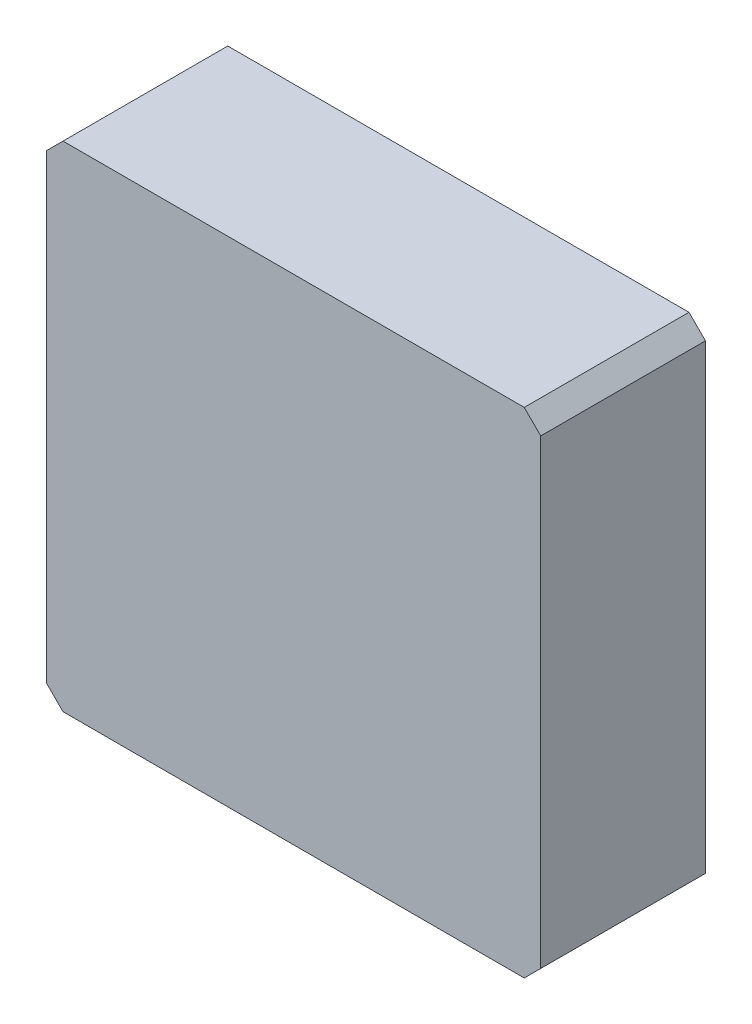
ISO-10303-21;
HEADER;
FILE_DESCRIPTION(('STEP AP214'),'2;1');
FILE_NAME('part.step','',(''),(''),'','','');
FILE_SCHEMA(('AUTOMOTIVE_DESIGN { 1 0 10303 214 1 1 1 1 }'));
ENDSEC;
DATA;
#1=APPLICATION_CONTEXT('core data for automotive mechanical design processes');
#2=APPLICATION_PROTOCOL_DEFINITION('international standard','automotive_design',2000,#1);
#3=PRODUCT_CONTEXT('',#1,'mechanical');
#4=PRODUCT('Part','Part','',(#3));
#5=PRODUCT_RELATED_PRODUCT_CATEGORY('part','',(#4));
#6=PRODUCT_DEFINITION_FORMATION('','',#4);
#7=PRODUCT_DEFINITION_CONTEXT('part definition',#1,'design');
#8=PRODUCT_DEFINITION('design','',#6,#7);
#9=PRODUCT_DEFINITION_SHAPE('','',#8);
#10=(LENGTH_UNIT() NAMED_UNIT(*) SI_UNIT(.MILLI.,.METRE.));
#11=(NAMED_UNIT(*) PLANE_ANGLE_UNIT() SI_UNIT($,.RADIAN.));
#12=(NAMED_UNIT(*) SI_UNIT($,.STERADIAN.) SOLID_ANGLE_UNIT());
#13=UNCERTAINTY_MEASURE_WITH_UNIT(LENGTH_MEASURE(1.E-05),#10,'distance_accuracy_value','');
#14=(GEOMETRIC_REPRESENTATION_CONTEXT(3) GLOBAL_UNCERTAINTY_ASSIGNED_CONTEXT((#13)) GLOBAL_UNIT_ASSIGNED_CONTEXT((#10,
#11,#12)) REPRESENTATION_CONTEXT('',''));
#15=CARTESIAN_POINT('',(0.,0.,0.));
#16=DIRECTION('',(0.,0.,1.));
#17=DIRECTION('',(1.,0.,0.));
#18=AXIS2_PLACEMENT_3D('',#15,#16,#17);
#19=CARTESIAN_POINT('',(15.,14.,5.));
#20=DIRECTION('',(1.,0.,0.));
#21=DIRECTION('',(0.,0.,-1.));
#22=AXIS2_PLACEMENT_3D('',#19,#20,#21);
#23=PLANE('',#22);
#24=DIRECTION('',(0.,-1.,0.));
#25=VECTOR('',#24,1.);
#26=CARTESIAN_POINT('',(15.,14.,-5.));
#27=LINE('',#26,#25);
#28=CARTESIAN_POINT('',(15.,14.,-5.));
#29=VERTEX_POINT('',#28);
#30=CARTESIAN_POINT('',(15.,-14.000000005,-5.));
#31=VERTEX_POINT('',#30);
#32=EDGE_CURVE('E129',#29,#31,#27,.T.);
#33=ORIENTED_EDGE('',*,*,#32,.F.);
#34=DIRECTION('',(0.,0.,-1.));
#35=VECTOR('',#34,1.);
#36=CARTESIAN_POINT('',(15.,14.,5.));
#37=LINE('',#36,#35);
#38=CARTESIAN_POINT('',(15.,14.,5.));
#39=VERTEX_POINT('',#38);
#40=EDGE_CURVE('E11',#39,#29,#37,.T.);
#41=ORIENTED_EDGE('',*,*,#40,.F.);
#42=DIRECTION('',(0.,-1.,0.));
#43=VECTOR('',#42,1.);
#44=CARTESIAN_POINT('',(15.,14.,5.));
#45=LINE('',#44,#43);
#46=CARTESIAN_POINT('',(15.,-14.000000005,5.));
#47=VERTEX_POINT('',#46);
#48=EDGE_CURVE('E149',#39,#47,#45,.T.);
#49=ORIENTED_EDGE('',*,*,#48,.T.);
#50=DIRECTION('',(0.,0.,-1.));
#51=VECTOR('',#50,1.);
#52=CARTESIAN_POINT('',(15.,-14.000000005,5.));
#53=LINE('',#52,#51);
#54=EDGE_CURVE('E35',#47,#31,#53,.T.);
#55=ORIENTED_EDGE('',*,*,#54,.T.);
#56=EDGE_LOOP('',(#33,#41,#49,#55));
#57=FACE_BOUND('',#56,.T.);
#58=ADVANCED_FACE('F32',(#57),#23,.T.);
#59=CARTESIAN_POINT('',(14.,15.,5.));
#60=DIRECTION('',(0.707106781186548,0.707106781186547,0.));
#61=DIRECTION('',(-0.707106781186547,0.707106781186548,0.));
#62=AXIS2_PLACEMENT_3D('',#59,#60,#61);
#63=PLANE('',#62);
#64=DIRECTION('',(0.707106781186547,-0.707106781186548,0.));
#65=VECTOR('',#64,1.);
#66=CARTESIAN_POINT('',(14.,15.,-5.));
#67=LINE('',#66,#65);
#68=CARTESIAN_POINT('',(14.,15.,-5.));
#69=VERTEX_POINT('',#68);
#70=EDGE_CURVE('E147',#69,#29,#67,.T.);
#71=ORIENTED_EDGE('',*,*,#70,.F.);
#72=DIRECTION('',(0.,0.,-1.));
#73=VECTOR('',#72,1.);
#74=CARTESIAN_POINT('',(14.,15.,5.));
#75=LINE('',#74,#73);
#76=CARTESIAN_POINT('',(14.,15.,5.));
#77=VERTEX_POINT('',#76);
#78=EDGE_CURVE('E41',#77,#69,#75,.T.);
#79=ORIENTED_EDGE('',*,*,#78,.F.);
#80=DIRECTION('',(0.707106781186547,-0.707106781186548,0.));
#81=VECTOR('',#80,1.);
#82=CARTESIAN_POINT('',(14.,15.,5.));
#83=LINE('',#82,#81);
#84=EDGE_CURVE('E119',#77,#39,#83,.T.);
#85=ORIENTED_EDGE('',*,*,#84,.T.);
#86=ORIENTED_EDGE('',*,*,#40,.T.);
#87=EDGE_LOOP('',(#71,#79,#85,#86));
#88=FACE_BOUND('',#87,.T.);
#89=ADVANCED_FACE('F161',(#88),#63,.T.);
#90=CARTESIAN_POINT('',(-14.0000000025,15.,5.));
#91=DIRECTION('',(0.,1.,0.));
#92=DIRECTION('',(0.,0.,1.));
#93=AXIS2_PLACEMENT_3D('',#90,#91,#92);
#94=PLANE('',#93);
#95=DIRECTION('',(1.,0.,0.));
#96=VECTOR('',#95,1.);
#97=CARTESIAN_POINT('',(-14.0000000025,15.,-5.));
#98=LINE('',#97,#96);
#99=CARTESIAN_POINT('',(-14.0000000025,15.,-5.));
#100=VERTEX_POINT('',#99);
#101=EDGE_CURVE('E106',#100,#69,#98,.T.);
#102=ORIENTED_EDGE('',*,*,#101,.F.);
#103=DIRECTION('',(0.,0.,-1.));
#104=VECTOR('',#103,1.);
#105=CARTESIAN_POINT('',(-14.0000000025,15.,5.));
#106=LINE('',#105,#104);
#107=CARTESIAN_POINT('',(-14.0000000025,15.,5.));
#108=VERTEX_POINT('',#107);
#109=EDGE_CURVE('E101',#108,#100,#106,.T.);
#110=ORIENTED_EDGE('',*,*,#109,.F.);
#111=DIRECTION('',(1.,0.,0.));
#112=VECTOR('',#111,1.);
#113=CARTESIAN_POINT('',(-14.0000000025,15.,5.));
#114=LINE('',#113,#112);
#115=EDGE_CURVE('E104',#108,#77,#114,.T.);
#116=ORIENTED_EDGE('',*,*,#115,.T.);
#117=ORIENTED_EDGE('',*,*,#78,.T.);
#118=EDGE_LOOP('',(#102,#110,#116,#117));
#119=FACE_BOUND('',#118,.T.);
#120=ADVANCED_FACE('F103',(#119),#94,.T.);
#121=CARTESIAN_POINT('',(-15.,14.0000000025,5.));
#122=DIRECTION('',(-0.707106781186548,0.707106781186548,0.));
#123=DIRECTION('',(-0.707106781186548,-0.707106781186548,0.));
#124=AXIS2_PLACEMENT_3D('',#121,#122,#123);
#125=PLANE('',#124);
#126=DIRECTION('',(0.707106781186547,0.707106781186547,0.));
#127=VECTOR('',#126,1.);
#128=CARTESIAN_POINT('',(-15.,14.0000000025,-5.));
#129=LINE('',#128,#127);
#130=CARTESIAN_POINT('',(-15.,14.0000000025,-5.));
#131=VERTEX_POINT('',#130);
#132=EDGE_CURVE('E144',#131,#100,#129,.T.);
#133=ORIENTED_EDGE('',*,*,#132,.F.);
#134=DIRECTION('',(0.,0.,-1.));
#135=VECTOR('',#134,1.);
#136=CARTESIAN_POINT('',(-15.,14.0000000025,5.));
#137=LINE('',#136,#135);
#138=CARTESIAN_POINT('',(-15.,14.0000000025,5.));
#139=VERTEX_POINT('',#138);
#140=EDGE_CURVE('E111',#139,#131,#137,.T.);
#141=ORIENTED_EDGE('',*,*,#140,.F.);
#142=DIRECTION('',(0.707106781186547,0.707106781186547,0.));
#143=VECTOR('',#142,1.);
#144=CARTESIAN_POINT('',(-15.,14.0000000025,5.));
#145=LINE('',#144,#143);
#146=EDGE_CURVE('E117',#139,#108,#145,.T.);
#147=ORIENTED_EDGE('',*,*,#146,.T.);
#148=ORIENTED_EDGE('',*,*,#109,.T.);
#149=EDGE_LOOP('',(#133,#141,#147,#148));
#150=FACE_BOUND('',#149,.T.);
#151=ADVANCED_FACE('F121',(#150),#125,.T.);
#152=CARTESIAN_POINT('',(-15.,-14.0000000025,5.));
#153=DIRECTION('',(-1.,0.,0.));
#154=DIRECTION('',(0.,0.,1.));
#155=AXIS2_PLACEMENT_3D('',#152,#153,#154);
#156=PLANE('',#155);
#157=DIRECTION('',(0.,1.,0.));
#158=VECTOR('',#157,1.);
#159=CARTESIAN_POINT('',(-15.,-14.0000000025,-5.));
#160=LINE('',#159,#158);
#161=CARTESIAN_POINT('',(-15.,-14.0000000025,-5.));
#162=VERTEX_POINT('',#161);
#163=EDGE_CURVE('E141',#162,#131,#160,.T.);
#164=ORIENTED_EDGE('',*,*,#163,.F.);
#165=DIRECTION('',(0.,0.,-1.));
#166=VECTOR('',#165,1.);
#167=CARTESIAN_POINT('',(-15.,-14.0000000025,5.));
#168=LINE('',#167,#166);
#169=CARTESIAN_POINT('',(-15.,-14.0000000025,5.));
#170=VERTEX_POINT('',#169);
#171=EDGE_CURVE('E153',#170,#162,#168,.T.);
#172=ORIENTED_EDGE('',*,*,#171,.F.);
#173=DIRECTION('',(0.,1.,0.));
#174=VECTOR('',#173,1.);
#175=CARTESIAN_POINT('',(-15.,-14.0000000025,5.));
#176=LINE('',#175,#174);
#177=EDGE_CURVE('E122',#170,#139,#176,.T.);
#178=ORIENTED_EDGE('',*,*,#177,.T.);
#179=ORIENTED_EDGE('',*,*,#140,.T.);
#180=EDGE_LOOP('',(#164,#172,#178,#179));
#181=FACE_BOUND('',#180,.T.);
#182=ADVANCED_FACE('F174',(#181),#156,.T.);
#183=CARTESIAN_POINT('',(-14.0000000025,-15.,5.));
#184=DIRECTION('',(-0.707106781186548,-0.707106781186548,0.));
#185=DIRECTION('',(0.707106781186548,-0.707106781186548,0.));
#186=AXIS2_PLACEMENT_3D('',#183,#184,#185);
#187=PLANE('',#186);
#188=DIRECTION('',(-0.707106781186547,0.707106781186547,0.));
#189=VECTOR('',#188,1.);
#190=CARTESIAN_POINT('',(-14.0000000025,-15.,-5.));
#191=LINE('',#190,#189);
#192=CARTESIAN_POINT('',(-14.0000000025,-15.,-5.));
#193=VERTEX_POINT('',#192);
#194=EDGE_CURVE('E138',#193,#162,#191,.T.);
#195=ORIENTED_EDGE('',*,*,#194,.F.);
#196=DIRECTION('',(0.,0.,-1.));
#197=VECTOR('',#196,1.);
#198=CARTESIAN_POINT('',(-14.0000000025,-15.,5.));
#199=LINE('',#198,#197);
#200=CARTESIAN_POINT('',(-14.0000000025,-15.,5.));
#201=VERTEX_POINT('',#200);
#202=EDGE_CURVE('E155',#201,#193,#199,.T.);
#203=ORIENTED_EDGE('',*,*,#202,.F.);
#204=DIRECTION('',(-0.707106781186547,0.707106781186547,0.));
#205=VECTOR('',#204,1.);
#206=CARTESIAN_POINT('',(-14.0000000025,-15.,5.));
#207=LINE('',#206,#205);
#208=EDGE_CURVE('E124',#201,#170,#207,.T.);
#209=ORIENTED_EDGE('',*,*,#208,.T.);
#210=ORIENTED_EDGE('',*,*,#171,.T.);
#211=EDGE_LOOP('',(#195,#203,#209,#210));
#212=FACE_BOUND('',#211,.T.);
#213=ADVANCED_FACE('F177',(#212),#187,.T.);
#214=CARTESIAN_POINT('',(14.000000005,-15.,5.));
#215=DIRECTION('',(0.,-1.,0.));
#216=DIRECTION('',(0.,0.,-1.));
#217=AXIS2_PLACEMENT_3D('',#214,#215,#216);
#218=PLANE('',#217);
#219=DIRECTION('',(-1.,0.,0.));
#220=VECTOR('',#219,1.);
#221=CARTESIAN_POINT('',(14.000000005,-15.,-5.));
#222=LINE('',#221,#220);
#223=CARTESIAN_POINT('',(14.000000005,-15.,-5.));
#224=VERTEX_POINT('',#223);
#225=EDGE_CURVE('E135',#224,#193,#222,.T.);
#226=ORIENTED_EDGE('',*,*,#225,.F.);
#227=DIRECTION('',(0.,0.,-1.));
#228=VECTOR('',#227,1.);
#229=CARTESIAN_POINT('',(14.000000005,-15.,5.));
#230=LINE('',#229,#228);
#231=CARTESIAN_POINT('',(14.000000005,-15.,5.));
#232=VERTEX_POINT('',#231);
#233=EDGE_CURVE('E156',#232,#224,#230,.T.);
#234=ORIENTED_EDGE('',*,*,#233,.F.);
#235=DIRECTION('',(-1.,0.,0.));
#236=VECTOR('',#235,1.);
#237=CARTESIAN_POINT('',(14.000000005,-15.,5.));
#238=LINE('',#237,#236);
#239=EDGE_CURVE('E252',#232,#201,#238,.T.);
#240=ORIENTED_EDGE('',*,*,#239,.T.);
#241=ORIENTED_EDGE('',*,*,#202,.T.);
#242=EDGE_LOOP('',(#226,#234,#240,#241));
#243=FACE_BOUND('',#242,.T.);
#244=ADVANCED_FACE('F181',(#243),#218,.T.);
#245=CARTESIAN_POINT('',(15.,-14.000000005,5.));
#246=DIRECTION('',(0.707106781186548,-0.707106781186548,0.));
#247=DIRECTION('',(0.707106781186548,0.707106781186548,0.));
#248=AXIS2_PLACEMENT_3D('',#245,#246,#247);
#249=PLANE('',#248);
#250=DIRECTION('',(-0.707106781186547,-0.707106781186547,0.));
#251=VECTOR('',#250,1.);
#252=CARTESIAN_POINT('',(15.,-14.000000005,-5.));
#253=LINE('',#252,#251);
#254=EDGE_CURVE('E132',#31,#224,#253,.T.);
#255=ORIENTED_EDGE('',*,*,#254,.F.);
#256=ORIENTED_EDGE('',*,*,#54,.F.);
#257=DIRECTION('',(-0.707106781186547,-0.707106781186547,0.));
#258=VECTOR('',#257,1.);
#259=CARTESIAN_POINT('',(15.,-14.000000005,5.));
#260=LINE('',#259,#258);
#261=EDGE_CURVE('E253',#47,#232,#260,.T.);
#262=ORIENTED_EDGE('',*,*,#261,.T.);
#263=ORIENTED_EDGE('',*,*,#233,.T.);
#264=EDGE_LOOP('',(#255,#256,#262,#263));
#265=FACE_BOUND('',#264,.T.);
#266=ADVANCED_FACE('F158',(#265),#249,.T.);
#267=CARTESIAN_POINT('',(0.,0.,5.));
#268=DIRECTION('',(0.,0.,-1.));
#269=DIRECTION('',(-1.,0.,0.));
#270=AXIS2_PLACEMENT_3D('',#267,#268,#269);
#271=PLANE('',#270);
#272=ORIENTED_EDGE('',*,*,#48,.F.);
#273=ORIENTED_EDGE('',*,*,#84,.F.);
#274=ORIENTED_EDGE('',*,*,#115,.F.);
#275=ORIENTED_EDGE('',*,*,#146,.F.);
#276=ORIENTED_EDGE('',*,*,#177,.F.);
#277=ORIENTED_EDGE('',*,*,#208,.F.);
#278=ORIENTED_EDGE('',*,*,#239,.F.);
#279=ORIENTED_EDGE('',*,*,#261,.F.);
#280=EDGE_LOOP('',(#272,#273,#274,#275,#276,#277,#278,#279));
#281=FACE_BOUND('',#280,.T.);
#282=ADVANCED_FACE('F115',(#281),#271,.F.);
#283=CARTESIAN_POINT('',(0.,0.,-5.));
#284=DIRECTION('',(0.,0.,-1.));
#285=DIRECTION('',(-1.,0.,0.));
#286=AXIS2_PLACEMENT_3D('',#283,#284,#285);
#287=PLANE('',#286);
#288=ORIENTED_EDGE('',*,*,#32,.T.);
#289=ORIENTED_EDGE('',*,*,#254,.T.);
#290=ORIENTED_EDGE('',*,*,#225,.T.);
#291=ORIENTED_EDGE('',*,*,#194,.T.);
#292=ORIENTED_EDGE('',*,*,#163,.T.);
#293=ORIENTED_EDGE('',*,*,#132,.T.);
#294=ORIENTED_EDGE('',*,*,#101,.T.);
#295=ORIENTED_EDGE('',*,*,#70,.T.);
#296=EDGE_LOOP('',(#288,#289,#290,#291,#292,#293,#294,#295));
#297=FACE_BOUND('',#296,.T.);
#298=ADVANCED_FACE('F160',(#297),#287,.T.);
#299=CLOSED_SHELL('',(#58,#89,#120,#151,#182,#213,#244,#266,#282,#298));
#300=MANIFOLD_SOLID_BREP('B2',#299);
#301=ADVANCED_BREP_SHAPE_REPRESENTATION('',(#18,#300),#14);
#302=SHAPE_DEFINITION_REPRESENTATION(#9,#301);
ENDSEC;
END-ISO-10303-21;
